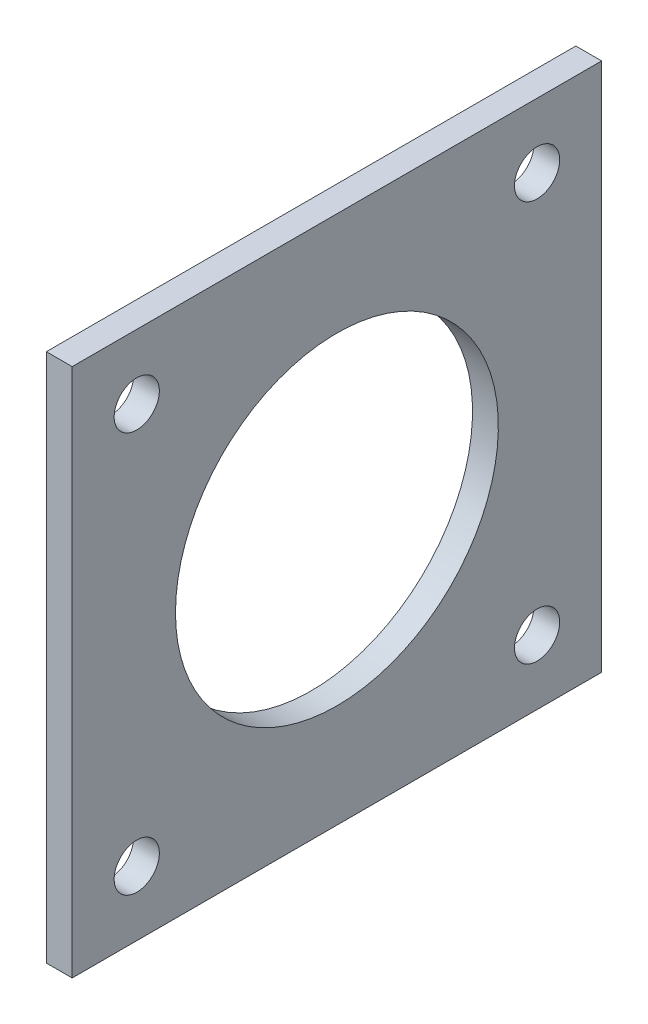
ISO-10303-21;
HEADER;
FILE_DESCRIPTION(('STEP AP214'),'2;1');
FILE_NAME('part.step','',(''),(''),'','','');
FILE_SCHEMA(('AUTOMOTIVE_DESIGN { 1 0 10303 214 1 1 1 1 }'));
ENDSEC;
DATA;
#1=APPLICATION_CONTEXT('core data for automotive mechanical design processes');
#2=APPLICATION_PROTOCOL_DEFINITION('international standard','automotive_design',2000,#1);
#3=PRODUCT_CONTEXT('',#1,'mechanical');
#4=PRODUCT('Part','Part','',(#3));
#5=PRODUCT_RELATED_PRODUCT_CATEGORY('part','',(#4));
#6=PRODUCT_DEFINITION_FORMATION('','',#4);
#7=PRODUCT_DEFINITION_CONTEXT('part definition',#1,'design');
#8=PRODUCT_DEFINITION('design','',#6,#7);
#9=PRODUCT_DEFINITION_SHAPE('','',#8);
#10=(LENGTH_UNIT() NAMED_UNIT(*) SI_UNIT(.MILLI.,.METRE.));
#11=(NAMED_UNIT(*) PLANE_ANGLE_UNIT() SI_UNIT($,.RADIAN.));
#12=(NAMED_UNIT(*) SI_UNIT($,.STERADIAN.) SOLID_ANGLE_UNIT());
#13=UNCERTAINTY_MEASURE_WITH_UNIT(LENGTH_MEASURE(1.E-05),#10,'distance_accuracy_value','');
#14=(GEOMETRIC_REPRESENTATION_CONTEXT(3) GLOBAL_UNCERTAINTY_ASSIGNED_CONTEXT((#13)) GLOBAL_UNIT_ASSIGNED_CONTEXT((#10,
#11,#12)) REPRESENTATION_CONTEXT('',''));
#15=CARTESIAN_POINT('',(0.,0.,0.));
#16=DIRECTION('',(0.,0.,1.));
#17=DIRECTION('',(1.,0.,0.));
#18=AXIS2_PLACEMENT_3D('',#15,#16,#17);
#19=CARTESIAN_POINT('',(5.00000000000003,-1.,0.));
#20=DIRECTION('',(0.,0.,1.));
#21=DIRECTION('',(1.,0.,0.));
#22=AXIS2_PLACEMENT_3D('',#19,#20,#21);
#23=PLANE('',#22);
#24=DIRECTION('',(0.,1.,0.));
#25=VECTOR('',#24,1.);
#26=CARTESIAN_POINT('',(1.49999999999979,24.,0.));
#27=LINE('',#26,#25);
#28=CARTESIAN_POINT('',(1.49999999999979,28.,0.));
#29=VERTEX_POINT('',#28);
#30=CARTESIAN_POINT('',(1.49999999999979,69.,0.));
#31=VERTEX_POINT('',#30);
#32=EDGE_CURVE('E12',#29,#31,#27,.T.);
#33=ORIENTED_EDGE('',*,*,#32,.F.);
#34=DIRECTION('',(-1.,0.,0.));
#35=VECTOR('',#34,1.);
#36=CARTESIAN_POINT('',(0.,28.,0.));
#37=LINE('',#36,#35);
#38=CARTESIAN_POINT('',(3.49999999999979,28.,0.));
#39=VERTEX_POINT('',#38);
#40=EDGE_CURVE('E128',#39,#29,#37,.T.);
#41=ORIENTED_EDGE('',*,*,#40,.F.);
#42=DIRECTION('',(0.,-1.,0.));
#43=VECTOR('',#42,1.);
#44=CARTESIAN_POINT('',(3.49999999999979,69.,0.));
#45=LINE('',#44,#43);
#46=CARTESIAN_POINT('',(3.49999999999979,69.,0.));
#47=VERTEX_POINT('',#46);
#48=EDGE_CURVE('E95',#47,#39,#45,.T.);
#49=ORIENTED_EDGE('',*,*,#48,.F.);
#50=DIRECTION('',(1.,0.,0.));
#51=VECTOR('',#50,1.);
#52=CARTESIAN_POINT('',(1.49999999999979,69.,0.));
#53=LINE('',#52,#51);
#54=EDGE_CURVE('E111',#31,#47,#53,.T.);
#55=ORIENTED_EDGE('',*,*,#54,.F.);
#56=EDGE_LOOP('',(#33,#41,#49,#55));
#57=FACE_BOUND('',#56,.T.);
#58=ADVANCED_FACE('F87',(#57),#23,.T.);
#59=CARTESIAN_POINT('',(3.49999999999979,69.,0.));
#60=DIRECTION('',(-1.,0.,0.));
#61=DIRECTION('',(0.,-1.,0.));
#62=AXIS2_PLACEMENT_3D('',#59,#60,#61);
#63=PLANE('',#62);
#64=CARTESIAN_POINT('',(3.49999999999978,48.5,-20.5));
#65=DIRECTION('',(-1.,0.,0.));
#66=DIRECTION('',(0.,-1.,0.));
#67=AXIS2_PLACEMENT_3D('',#64,#65,#66);
#68=CIRCLE('',#67,12.5);
#69=CARTESIAN_POINT('',(3.49999999999978,36.,-20.5));
#70=VERTEX_POINT('',#69);
#71=EDGE_CURVE('E135',#70,#70,#68,.T.);
#72=ORIENTED_EDGE('',*,*,#71,.T.);
#73=EDGE_LOOP('',(#72));
#74=FACE_BOUND('',#73,.T.);
#75=CARTESIAN_POINT('',(3.49999999999979,32.9999999999998,-36.));
#76=DIRECTION('',(-1.,0.,0.));
#77=DIRECTION('',(0.,-1.,0.));
#78=AXIS2_PLACEMENT_3D('',#75,#76,#77);
#79=CIRCLE('',#78,1.75);
#80=CARTESIAN_POINT('',(3.49999999999979,31.2499999999998,-36.));
#81=VERTEX_POINT('',#80);
#82=EDGE_CURVE('E159',#81,#81,#79,.T.);
#83=ORIENTED_EDGE('',*,*,#82,.T.);
#84=EDGE_LOOP('',(#83));
#85=FACE_BOUND('',#84,.T.);
#86=CARTESIAN_POINT('',(3.49999999999979,64.,-5.00000000000013));
#87=DIRECTION('',(-1.,0.,0.));
#88=DIRECTION('',(0.,-1.,0.));
#89=AXIS2_PLACEMENT_3D('',#86,#87,#88);
#90=CIRCLE('',#89,1.75);
#91=CARTESIAN_POINT('',(3.49999999999979,62.25,-5.00000000000013));
#92=VERTEX_POINT('',#91);
#93=EDGE_CURVE('E163',#92,#92,#90,.T.);
#94=ORIENTED_EDGE('',*,*,#93,.T.);
#95=EDGE_LOOP('',(#94));
#96=FACE_BOUND('',#95,.T.);
#97=CARTESIAN_POINT('',(3.49999999999979,33.,-5.00000000000002));
#98=DIRECTION('',(-1.,0.,0.));
#99=DIRECTION('',(0.,-1.,0.));
#100=AXIS2_PLACEMENT_3D('',#97,#98,#99);
#101=CIRCLE('',#100,1.75);
#102=CARTESIAN_POINT('',(3.49999999999979,31.25,-5.00000000000002));
#103=VERTEX_POINT('',#102);
#104=EDGE_CURVE('E165',#103,#103,#101,.T.);
#105=ORIENTED_EDGE('',*,*,#104,.T.);
#106=EDGE_LOOP('',(#105));
#107=FACE_BOUND('',#106,.T.);
#108=CARTESIAN_POINT('',(3.49999999999979,63.9999999999998,-36.0000000000001));
#109=DIRECTION('',(-1.,0.,0.));
#110=DIRECTION('',(0.,-1.,0.));
#111=AXIS2_PLACEMENT_3D('',#108,#109,#110);
#112=CIRCLE('',#111,1.75);
#113=CARTESIAN_POINT('',(3.49999999999979,62.2499999999998,-36.0000000000001));
#114=VERTEX_POINT('',#113);
#115=EDGE_CURVE('E90',#114,#114,#112,.T.);
#116=ORIENTED_EDGE('',*,*,#115,.T.);
#117=EDGE_LOOP('',(#116));
#118=FACE_BOUND('',#117,.T.);
#119=DIRECTION('',(0.,0.,-1.));
#120=VECTOR('',#119,1.);
#121=CARTESIAN_POINT('',(3.49999999999979,28.,0.));
#122=LINE('',#121,#120);
#123=CARTESIAN_POINT('',(3.49999999999973,28.,-41.));
#124=VERTEX_POINT('',#123);
#125=EDGE_CURVE('E130',#39,#124,#122,.T.);
#126=ORIENTED_EDGE('',*,*,#125,.T.);
#127=DIRECTION('',(0.,-1.,0.));
#128=VECTOR('',#127,1.);
#129=CARTESIAN_POINT('',(3.4999999999995,69.,-41.));
#130=LINE('',#129,#128);
#131=CARTESIAN_POINT('',(3.4999999999995,69.,-41.));
#132=VERTEX_POINT('',#131);
#133=EDGE_CURVE('E180',#132,#124,#130,.T.);
#134=ORIENTED_EDGE('',*,*,#133,.F.);
#135=DIRECTION('',(0.,0.,-1.));
#136=VECTOR('',#135,1.);
#137=CARTESIAN_POINT('',(3.49999999999979,69.,0.));
#138=LINE('',#137,#136);
#139=EDGE_CURVE('E145',#47,#132,#138,.T.);
#140=ORIENTED_EDGE('',*,*,#139,.F.);
#141=ORIENTED_EDGE('',*,*,#48,.T.);
#142=EDGE_LOOP('',(#126,#134,#140,#141));
#143=FACE_BOUND('',#142,.T.);
#144=ADVANCED_FACE('F186',(#74,#85,#96,#107,#118,#143),#63,.F.);
#145=CARTESIAN_POINT('',(1.49999999999979,0.,0.));
#146=DIRECTION('',(1.,0.,0.));
#147=DIRECTION('',(0.,0.,-1.));
#148=AXIS2_PLACEMENT_3D('',#145,#146,#147);
#149=PLANE('',#148);
#150=CARTESIAN_POINT('',(1.49999999999965,48.5,-20.5));
#151=DIRECTION('',(-1.,0.,0.));
#152=DIRECTION('',(0.,0.,1.));
#153=AXIS2_PLACEMENT_3D('',#150,#151,#152);
#154=CIRCLE('',#153,12.5);
#155=CARTESIAN_POINT('',(1.49999999999974,48.5,-8.));
#156=VERTEX_POINT('',#155);
#157=EDGE_CURVE('E187',#156,#156,#154,.T.);
#158=ORIENTED_EDGE('',*,*,#157,.F.);
#159=EDGE_LOOP('',(#158));
#160=FACE_BOUND('',#159,.T.);
#161=CARTESIAN_POINT('',(1.49999999999954,63.9999999999998,-36.0000000000001));
#162=DIRECTION('',(-1.,0.,0.));
#163=DIRECTION('',(0.,0.,1.));
#164=AXIS2_PLACEMENT_3D('',#161,#162,#163);
#165=CIRCLE('',#164,1.75);
#166=CARTESIAN_POINT('',(1.49999999999955,63.9999999999998,-34.2500000000001));
#167=VERTEX_POINT('',#166);
#168=EDGE_CURVE('E134',#167,#167,#165,.T.);
#169=ORIENTED_EDGE('',*,*,#168,.F.);
#170=EDGE_LOOP('',(#169));
#171=FACE_BOUND('',#170,.T.);
#172=CARTESIAN_POINT('',(1.49999999999976,33.,-5.00000000000001));
#173=DIRECTION('',(-1.,0.,0.));
#174=DIRECTION('',(0.,0.,1.));
#175=AXIS2_PLACEMENT_3D('',#172,#173,#174);
#176=CIRCLE('',#175,1.75);
#177=CARTESIAN_POINT('',(1.49999999999977,33.,-3.25000000000001));
#178=VERTEX_POINT('',#177);
#179=EDGE_CURVE('E194',#178,#178,#176,.T.);
#180=ORIENTED_EDGE('',*,*,#179,.F.);
#181=EDGE_LOOP('',(#180));
#182=FACE_BOUND('',#181,.T.);
#183=CARTESIAN_POINT('',(1.49999999999976,64.,-5.00000000000012));
#184=DIRECTION('',(-1.,0.,0.));
#185=DIRECTION('',(0.,0.,1.));
#186=AXIS2_PLACEMENT_3D('',#183,#184,#185);
#187=CIRCLE('',#186,1.75);
#188=CARTESIAN_POINT('',(1.49999999999977,64.,-3.25000000000012));
#189=VERTEX_POINT('',#188);
#190=EDGE_CURVE('E166',#189,#189,#187,.T.);
#191=ORIENTED_EDGE('',*,*,#190,.F.);
#192=EDGE_LOOP('',(#191));
#193=FACE_BOUND('',#192,.T.);
#194=CARTESIAN_POINT('',(1.49999999999954,32.9999999999998,-36.));
#195=DIRECTION('',(-1.,0.,0.));
#196=DIRECTION('',(0.,0.,1.));
#197=AXIS2_PLACEMENT_3D('',#194,#195,#196);
#198=CIRCLE('',#197,1.75);
#199=CARTESIAN_POINT('',(1.49999999999955,32.9999999999998,-34.25));
#200=VERTEX_POINT('',#199);
#201=EDGE_CURVE('E162',#200,#200,#198,.T.);
#202=ORIENTED_EDGE('',*,*,#201,.F.);
#203=EDGE_LOOP('',(#202));
#204=FACE_BOUND('',#203,.T.);
#205=DIRECTION('',(0.,-1.,0.));
#206=VECTOR('',#205,1.);
#207=CARTESIAN_POINT('',(1.4999999999995,69.,-41.));
#208=LINE('',#207,#206);
#209=CARTESIAN_POINT('',(1.4999999999995,69.,-41.));
#210=VERTEX_POINT('',#209);
#211=CARTESIAN_POINT('',(1.4999999999995,28.,-41.));
#212=VERTEX_POINT('',#211);
#213=EDGE_CURVE('E141',#210,#212,#208,.T.);
#214=ORIENTED_EDGE('',*,*,#213,.T.);
#215=DIRECTION('',(0.,0.,-1.));
#216=VECTOR('',#215,1.);
#217=CARTESIAN_POINT('',(1.49999999999979,28.,0.));
#218=LINE('',#217,#216);
#219=EDGE_CURVE('E103',#29,#212,#218,.T.);
#220=ORIENTED_EDGE('',*,*,#219,.F.);
#221=ORIENTED_EDGE('',*,*,#32,.T.);
#222=DIRECTION('',(0.,0.,1.));
#223=VECTOR('',#222,1.);
#224=CARTESIAN_POINT('',(1.49999999999979,69.,0.));
#225=LINE('',#224,#223);
#226=EDGE_CURVE('E146',#210,#31,#225,.T.);
#227=ORIENTED_EDGE('',*,*,#226,.F.);
#228=EDGE_LOOP('',(#214,#220,#221,#227));
#229=FACE_BOUND('',#228,.T.);
#230=ADVANCED_FACE('F139',(#160,#171,#182,#193,#204,#229),#149,.F.);
#231=CARTESIAN_POINT('',(0.,69.,0.));
#232=DIRECTION('',(0.,-1.,0.));
#233=DIRECTION('',(0.,0.,-1.));
#234=AXIS2_PLACEMENT_3D('',#231,#232,#233);
#235=PLANE('',#234);
#236=ORIENTED_EDGE('',*,*,#226,.T.);
#237=ORIENTED_EDGE('',*,*,#54,.T.);
#238=ORIENTED_EDGE('',*,*,#139,.T.);
#239=DIRECTION('',(-1.,0.,0.));
#240=VECTOR('',#239,1.);
#241=CARTESIAN_POINT('',(3.4999999999995,69.,-41.));
#242=LINE('',#241,#240);
#243=EDGE_CURVE('E151',#132,#210,#242,.T.);
#244=ORIENTED_EDGE('',*,*,#243,.T.);
#245=EDGE_LOOP('',(#236,#237,#238,#244));
#246=FACE_BOUND('',#245,.T.);
#247=ADVANCED_FACE('F149',(#246),#235,.F.);
#248=CARTESIAN_POINT('',(3.4999999999995,69.,-41.));
#249=DIRECTION('',(0.,0.,-1.));
#250=DIRECTION('',(-1.,0.,0.));
#251=AXIS2_PLACEMENT_3D('',#248,#249,#250);
#252=PLANE('',#251);
#253=DIRECTION('',(-1.,0.,0.));
#254=VECTOR('',#253,1.);
#255=CARTESIAN_POINT('',(51.5,28.,-41.0000000000004));
#256=LINE('',#255,#254);
#257=EDGE_CURVE('E142',#124,#212,#256,.T.);
#258=ORIENTED_EDGE('',*,*,#257,.T.);
#259=ORIENTED_EDGE('',*,*,#213,.F.);
#260=ORIENTED_EDGE('',*,*,#243,.F.);
#261=ORIENTED_EDGE('',*,*,#133,.T.);
#262=EDGE_LOOP('',(#258,#259,#260,#261));
#263=FACE_BOUND('',#262,.T.);
#264=ADVANCED_FACE('F184',(#263),#252,.T.);
#265=CARTESIAN_POINT('',(10.4999999999995,32.9999999999998,-36.0000000000001));
#266=DIRECTION('',(-1.,0.,0.));
#267=DIRECTION('',(0.,0.,1.));
#268=AXIS2_PLACEMENT_3D('',#265,#266,#267);
#269=CYLINDRICAL_SURFACE('',#268,1.75);
#270=ORIENTED_EDGE('',*,*,#201,.T.);
#271=EDGE_LOOP('',(#270));
#272=FACE_BOUND('',#271,.T.);
#273=ORIENTED_EDGE('',*,*,#82,.F.);
#274=EDGE_LOOP('',(#273));
#275=FACE_BOUND('',#274,.T.);
#276=ADVANCED_FACE('F215',(#272,#275),#269,.F.);
#277=CARTESIAN_POINT('',(10.4999999999998,64.,-5.00000000000018));
#278=DIRECTION('',(-1.,0.,0.));
#279=DIRECTION('',(0.,0.,1.));
#280=AXIS2_PLACEMENT_3D('',#277,#278,#279);
#281=CYLINDRICAL_SURFACE('',#280,1.75);
#282=ORIENTED_EDGE('',*,*,#190,.T.);
#283=EDGE_LOOP('',(#282));
#284=FACE_BOUND('',#283,.T.);
#285=ORIENTED_EDGE('',*,*,#93,.F.);
#286=EDGE_LOOP('',(#285));
#287=FACE_BOUND('',#286,.T.);
#288=ADVANCED_FACE('F211',(#284,#287),#281,.F.);
#289=CARTESIAN_POINT('',(10.4999999999998,33.,-5.00000000000007));
#290=DIRECTION('',(-1.,0.,0.));
#291=DIRECTION('',(0.,0.,1.));
#292=AXIS2_PLACEMENT_3D('',#289,#290,#291);
#293=CYLINDRICAL_SURFACE('',#292,1.75);
#294=ORIENTED_EDGE('',*,*,#179,.T.);
#295=EDGE_LOOP('',(#294));
#296=FACE_BOUND('',#295,.T.);
#297=ORIENTED_EDGE('',*,*,#104,.F.);
#298=EDGE_LOOP('',(#297));
#299=FACE_BOUND('',#298,.T.);
#300=ADVANCED_FACE('F214',(#296,#299),#293,.F.);
#301=CARTESIAN_POINT('',(10.4999999999995,63.9999999999998,-36.0000000000002));
#302=DIRECTION('',(-1.,0.,0.));
#303=DIRECTION('',(0.,0.,1.));
#304=AXIS2_PLACEMENT_3D('',#301,#302,#303);
#305=CYLINDRICAL_SURFACE('',#304,1.75);
#306=ORIENTED_EDGE('',*,*,#168,.T.);
#307=EDGE_LOOP('',(#306));
#308=FACE_BOUND('',#307,.T.);
#309=ORIENTED_EDGE('',*,*,#115,.F.);
#310=EDGE_LOOP('',(#309));
#311=FACE_BOUND('',#310,.T.);
#312=ADVANCED_FACE('F199',(#308,#311),#305,.F.);
#313=CARTESIAN_POINT('',(156.5,48.5,-20.5000000000011));
#314=DIRECTION('',(-1.,0.,0.));
#315=DIRECTION('',(0.,0.,1.));
#316=AXIS2_PLACEMENT_3D('',#313,#314,#315);
#317=CYLINDRICAL_SURFACE('',#316,12.5);
#318=ORIENTED_EDGE('',*,*,#157,.T.);
#319=EDGE_LOOP('',(#318));
#320=FACE_BOUND('',#319,.T.);
#321=ORIENTED_EDGE('',*,*,#71,.F.);
#322=EDGE_LOOP('',(#321));
#323=FACE_BOUND('',#322,.T.);
#324=ADVANCED_FACE('F235',(#320,#323),#317,.F.);
#325=CARTESIAN_POINT('',(51.5000000000003,28.,-3.67563537977622E-13));
#326=DIRECTION('',(0.,1.,0.));
#327=DIRECTION('',(0.,0.,1.));
#328=AXIS2_PLACEMENT_3D('',#325,#326,#327);
#329=PLANE('',#328);
#330=ORIENTED_EDGE('',*,*,#40,.T.);
#331=ORIENTED_EDGE('',*,*,#219,.T.);
#332=ORIENTED_EDGE('',*,*,#257,.F.);
#333=ORIENTED_EDGE('',*,*,#125,.F.);
#334=EDGE_LOOP('',(#330,#331,#332,#333));
#335=FACE_BOUND('',#334,.T.);
#336=ADVANCED_FACE('F129',(#335),#329,.F.);
#337=CLOSED_SHELL('',(#58,#144,#230,#247,#264,#276,#288,#300,#312,#324,#336));
#338=MANIFOLD_SOLID_BREP('B2',#337);
#339=ADVANCED_BREP_SHAPE_REPRESENTATION('',(#18,#338),#14);
#340=SHAPE_DEFINITION_REPRESENTATION(#9,#339);
ENDSEC;
END-ISO-10303-21;
